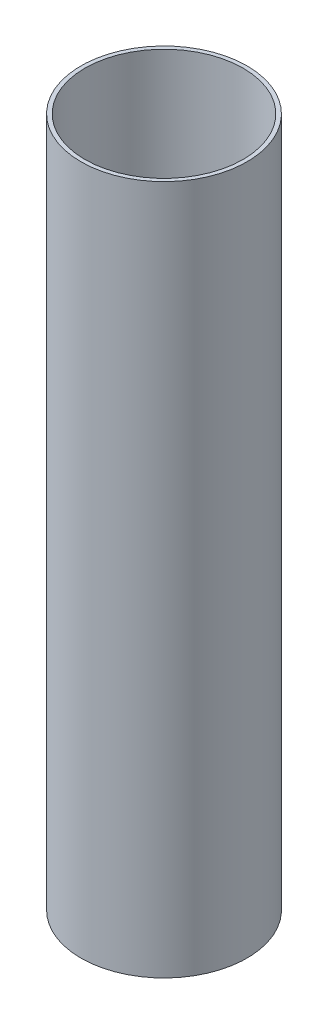
ISO-10303-21;
HEADER;
FILE_DESCRIPTION(('STEP AP214'),'2;1');
FILE_NAME('part.step','',(''),(''),'','','');
FILE_SCHEMA(('AUTOMOTIVE_DESIGN { 1 0 10303 214 1 1 1 1 }'));
ENDSEC;
DATA;
#1=APPLICATION_CONTEXT('core data for automotive mechanical design processes');
#2=APPLICATION_PROTOCOL_DEFINITION('international standard','automotive_design',2000,#1);
#3=PRODUCT_CONTEXT('',#1,'mechanical');
#4=PRODUCT('Part','Part','',(#3));
#5=PRODUCT_RELATED_PRODUCT_CATEGORY('part','',(#4));
#6=PRODUCT_DEFINITION_FORMATION('','',#4);
#7=PRODUCT_DEFINITION_CONTEXT('part definition',#1,'design');
#8=PRODUCT_DEFINITION('design','',#6,#7);
#9=PRODUCT_DEFINITION_SHAPE('','',#8);
#10=(LENGTH_UNIT() NAMED_UNIT(*) SI_UNIT(.MILLI.,.METRE.));
#11=(NAMED_UNIT(*) PLANE_ANGLE_UNIT() SI_UNIT($,.RADIAN.));
#12=(NAMED_UNIT(*) SI_UNIT($,.STERADIAN.) SOLID_ANGLE_UNIT());
#13=UNCERTAINTY_MEASURE_WITH_UNIT(LENGTH_MEASURE(1.E-05),#10,'distance_accuracy_value','');
#14=(GEOMETRIC_REPRESENTATION_CONTEXT(3) GLOBAL_UNCERTAINTY_ASSIGNED_CONTEXT((#13)) GLOBAL_UNIT_ASSIGNED_CONTEXT((#10,
#11,#12)) REPRESENTATION_CONTEXT('',''));
#15=CARTESIAN_POINT('',(0.,0.,0.));
#16=DIRECTION('',(0.,0.,1.));
#17=DIRECTION('',(1.,0.,0.));
#18=AXIS2_PLACEMENT_3D('',#15,#16,#17);
#19=CARTESIAN_POINT('',(0.,0.3,0.));
#20=DIRECTION('',(0.,-1.,0.));
#21=DIRECTION('',(0.,0.,-1.));
#22=AXIS2_PLACEMENT_3D('',#19,#20,#21);
#23=CYLINDRICAL_SURFACE('',#22,6.3);
#24=CARTESIAN_POINT('',(0.,0.,0.));
#25=DIRECTION('',(0.,1.,0.));
#26=DIRECTION('',(0.,0.,1.));
#27=AXIS2_PLACEMENT_3D('',#24,#25,#26);
#28=CIRCLE('',#27,6.3);
#29=CARTESIAN_POINT('',(0.,0.,6.3));
#30=VERTEX_POINT('',#29);
#31=EDGE_CURVE('E37',#30,#30,#28,.T.);
#32=ORIENTED_EDGE('',*,*,#31,.T.);
#33=EDGE_LOOP('',(#32));
#34=FACE_BOUND('',#33,.T.);
#35=CARTESIAN_POINT('',(0.,52.3,0.));
#36=DIRECTION('',(0.,1.,0.));
#37=DIRECTION('',(0.,0.,1.));
#38=AXIS2_PLACEMENT_3D('',#35,#36,#37);
#39=CIRCLE('',#38,6.3);
#40=CARTESIAN_POINT('',(0.,52.3,6.3));
#41=VERTEX_POINT('',#40);
#42=EDGE_CURVE('E41',#41,#41,#39,.T.);
#43=ORIENTED_EDGE('',*,*,#42,.F.);
#44=EDGE_LOOP('',(#43));
#45=FACE_BOUND('',#44,.T.);
#46=ADVANCED_FACE('F31',(#34,#45),#23,.T.);
#47=CARTESIAN_POINT('',(0.,0.,0.));
#48=DIRECTION('',(0.,1.,0.));
#49=DIRECTION('',(0.,0.,1.));
#50=AXIS2_PLACEMENT_3D('',#47,#48,#49);
#51=PLANE('',#50);
#52=ORIENTED_EDGE('',*,*,#31,.F.);
#53=EDGE_LOOP('',(#52));
#54=FACE_BOUND('',#53,.T.);
#55=ADVANCED_FACE('F55',(#54),#51,.F.);
#56=CARTESIAN_POINT('',(0.,52.3,0.));
#57=DIRECTION('',(0.,1.,0.));
#58=DIRECTION('',(0.,0.,1.));
#59=AXIS2_PLACEMENT_3D('',#56,#57,#58);
#60=PLANE('',#59);
#61=ORIENTED_EDGE('',*,*,#42,.T.);
#62=EDGE_LOOP('',(#61));
#63=FACE_BOUND('',#62,.T.);
#64=CARTESIAN_POINT('',(0.,52.3,0.));
#65=DIRECTION('',(0.,1.,0.));
#66=DIRECTION('',(0.,0.,1.));
#67=AXIS2_PLACEMENT_3D('',#64,#65,#66);
#68=CIRCLE('',#67,6.);
#69=CARTESIAN_POINT('',(0.,52.3,-6.));
#70=VERTEX_POINT('',#69);
#71=EDGE_CURVE('E45',#70,#70,#68,.T.);
#72=ORIENTED_EDGE('',*,*,#71,.F.);
#73=EDGE_LOOP('',(#72));
#74=FACE_BOUND('',#73,.T.);
#75=ADVANCED_FACE('F53',(#63,#74),#60,.T.);
#76=CARTESIAN_POINT('',(0.,52.3,0.));
#77=DIRECTION('',(0.,-1.,0.));
#78=DIRECTION('',(0.,0.,-1.));
#79=AXIS2_PLACEMENT_3D('',#76,#77,#78);
#80=CYLINDRICAL_SURFACE('',#79,6.);
#81=CARTESIAN_POINT('',(0.,0.300000000000002,0.));
#82=DIRECTION('',(0.,1.,0.));
#83=DIRECTION('',(0.,0.,1.));
#84=AXIS2_PLACEMENT_3D('',#81,#82,#83);
#85=CIRCLE('',#84,6.);
#86=CARTESIAN_POINT('',(0.,0.300000000000002,-6.));
#87=VERTEX_POINT('',#86);
#88=EDGE_CURVE('E10',#87,#87,#85,.F.);
#89=CARTESIAN_POINT('',(0.,52.3,-6.));
#90=CARTESIAN_POINT('',(0.,51.7583333333333,-6.));
#91=CARTESIAN_POINT('',(0.,51.2166666666667,-6.));
#92=CARTESIAN_POINT('',(0.,50.1333333333333,-6.));
#93=CARTESIAN_POINT('',(0.,49.5916666666667,-6.));
#94=CARTESIAN_POINT('',(0.,48.5083333333333,-6.));
#95=CARTESIAN_POINT('',(0.,47.9666666666667,-6.));
#96=CARTESIAN_POINT('',(0.,46.8833333333333,-6.));
#97=CARTESIAN_POINT('',(0.,46.3416666666667,-6.));
#98=CARTESIAN_POINT('',(0.,45.2583333333333,-6.));
#99=CARTESIAN_POINT('',(0.,44.7166666666667,-6.));
#100=CARTESIAN_POINT('',(0.,43.6333333333333,-6.));
#101=CARTESIAN_POINT('',(0.,43.0916666666667,-6.));
#102=CARTESIAN_POINT('',(0.,42.0083333333333,-6.));
#103=CARTESIAN_POINT('',(0.,41.4666666666667,-6.));
#104=CARTESIAN_POINT('',(0.,40.3833333333333,-6.));
#105=CARTESIAN_POINT('',(0.,39.8416666666667,-6.));
#106=CARTESIAN_POINT('',(0.,38.7583333333333,-6.));
#107=CARTESIAN_POINT('',(0.,38.2166666666667,-6.));
#108=CARTESIAN_POINT('',(0.,37.1333333333333,-6.));
#109=CARTESIAN_POINT('',(0.,36.5916666666667,-6.));
#110=CARTESIAN_POINT('',(0.,35.5083333333333,-6.));
#111=CARTESIAN_POINT('',(0.,34.9666666666667,-6.));
#112=CARTESIAN_POINT('',(0.,33.8833333333333,-6.));
#113=CARTESIAN_POINT('',(0.,33.3416666666667,-6.));
#114=CARTESIAN_POINT('',(0.,32.2583333333333,-6.));
#115=CARTESIAN_POINT('',(0.,31.7166666666667,-6.));
#116=CARTESIAN_POINT('',(0.,30.6333333333333,-6.));
#117=CARTESIAN_POINT('',(0.,30.0916666666667,-6.));
#118=CARTESIAN_POINT('',(0.,29.0083333333333,-6.));
#119=CARTESIAN_POINT('',(0.,28.4666666666667,-6.));
#120=CARTESIAN_POINT('',(0.,27.3833333333333,-6.));
#121=CARTESIAN_POINT('',(0.,26.8416666666667,-6.));
#122=CARTESIAN_POINT('',(0.,25.7583333333333,-6.));
#123=CARTESIAN_POINT('',(0.,25.2166666666667,-6.));
#124=CARTESIAN_POINT('',(0.,24.1333333333333,-6.));
#125=CARTESIAN_POINT('',(0.,23.5916666666667,-6.));
#126=CARTESIAN_POINT('',(0.,22.5083333333333,-6.));
#127=CARTESIAN_POINT('',(0.,21.9666666666667,-6.));
#128=CARTESIAN_POINT('',(0.,20.8833333333333,-6.));
#129=CARTESIAN_POINT('',(0.,20.3416666666667,-6.));
#130=CARTESIAN_POINT('',(0.,19.2583333333333,-6.));
#131=CARTESIAN_POINT('',(0.,18.7166666666667,-6.));
#132=CARTESIAN_POINT('',(0.,17.6333333333333,-6.));
#133=CARTESIAN_POINT('',(0.,17.0916666666667,-6.));
#134=CARTESIAN_POINT('',(0.,16.0083333333333,-6.));
#135=CARTESIAN_POINT('',(0.,15.4666666666667,-6.));
#136=CARTESIAN_POINT('',(0.,14.3833333333333,-6.));
#137=CARTESIAN_POINT('',(0.,13.8416666666667,-6.));
#138=CARTESIAN_POINT('',(0.,12.7583333333333,-6.));
#139=CARTESIAN_POINT('',(0.,12.2166666666667,-6.));
#140=CARTESIAN_POINT('',(0.,11.1333333333333,-6.));
#141=CARTESIAN_POINT('',(0.,10.5916666666667,-6.));
#142=CARTESIAN_POINT('',(0.,9.50833333333334,-6.));
#143=CARTESIAN_POINT('',(0.,8.96666666666667,-6.));
#144=CARTESIAN_POINT('',(0.,7.88333333333333,-6.));
#145=CARTESIAN_POINT('',(0.,7.34166666666667,-6.));
#146=CARTESIAN_POINT('',(0.,6.25833333333333,-6.));
#147=CARTESIAN_POINT('',(0.,5.71666666666667,-6.));
#148=CARTESIAN_POINT('',(0.,4.63333333333333,-6.));
#149=CARTESIAN_POINT('',(0.,4.09166666666667,-6.));
#150=CARTESIAN_POINT('',(0.,3.00833333333334,-6.));
#151=CARTESIAN_POINT('',(0.,2.46666666666667,-6.));
#152=CARTESIAN_POINT('',(0.,1.38333333333334,-6.));
#153=CARTESIAN_POINT('',(0.,0.841666666666669,-6.));
#154=CARTESIAN_POINT('',(0.,0.300000000000002,-6.));
#155=B_SPLINE_CURVE_WITH_KNOTS('',3,(#89,#90,#91,#92,#93,#94,#95,#96,#97,#98,#99,#100,#101,#102,
#103,#104,#105,#106,#107,#108,#109,#110,#111,#112,#113,#114,#115,#116,#117,#118,#119,#120,#121,
#122,#123,#124,#125,#126,#127,#128,#129,#130,#131,#132,#133,#134,#135,#136,#137,#138,#139,#140,
#141,#142,#143,#144,#145,#146,#147,#148,#149,#150,#151,#152,#153,#154),.UNSPECIFIED.,.F.,.F.,(4,
2,2,2,2,2,2,2,2,2,2,2,2,2,2,2,2,2,2,2,2,2,2,2,2,2,2,2,2,2,2,2,4),(0.,1.625,3.25,4.875,
6.50000000000001,8.125,9.75,11.375,13.,14.625,16.25,17.875,19.5,21.125,22.75,24.375,26.,27.625,
29.25,30.875,32.5,34.125,35.75,37.375,39.,40.625,42.25,43.875,45.5,47.125,48.75,50.375,52.),.UNSPECIFIED.);
#156=EDGE_CURVE('BSEAM51',#70,#87,#155,.T.);
#157=ORIENTED_EDGE('',*,*,#71,.T.);
#158=ORIENTED_EDGE('',*,*,#88,.T.);
#159=ORIENTED_EDGE('',*,*,#156,.T.);
#160=ORIENTED_EDGE('',*,*,#156,.F.);
#161=EDGE_LOOP('',(#157,#159,#158,#160));
#162=FACE_BOUND('',#161,.T.);
#163=ADVANCED_FACE('F51',(#162),#80,.F.);
#164=CARTESIAN_POINT('',(0.,0.3,0.));
#165=DIRECTION('',(0.,1.,0.));
#166=DIRECTION('',(0.,0.,1.));
#167=AXIS2_PLACEMENT_3D('',#164,#165,#166);
#168=PLANE('',#167);
#169=ORIENTED_EDGE('',*,*,#88,.F.);
#170=EDGE_LOOP('',(#169));
#171=FACE_BOUND('',#170,.T.);
#172=ADVANCED_FACE('F62',(#171),#168,.T.);
#173=CLOSED_SHELL('',(#46,#55,#75,#163,#172));
#174=MANIFOLD_SOLID_BREP('B2',#173);
#175=ADVANCED_BREP_SHAPE_REPRESENTATION('',(#18,#174),#14);
#176=SHAPE_DEFINITION_REPRESENTATION(#9,#175);
ENDSEC;
END-ISO-10303-21;
